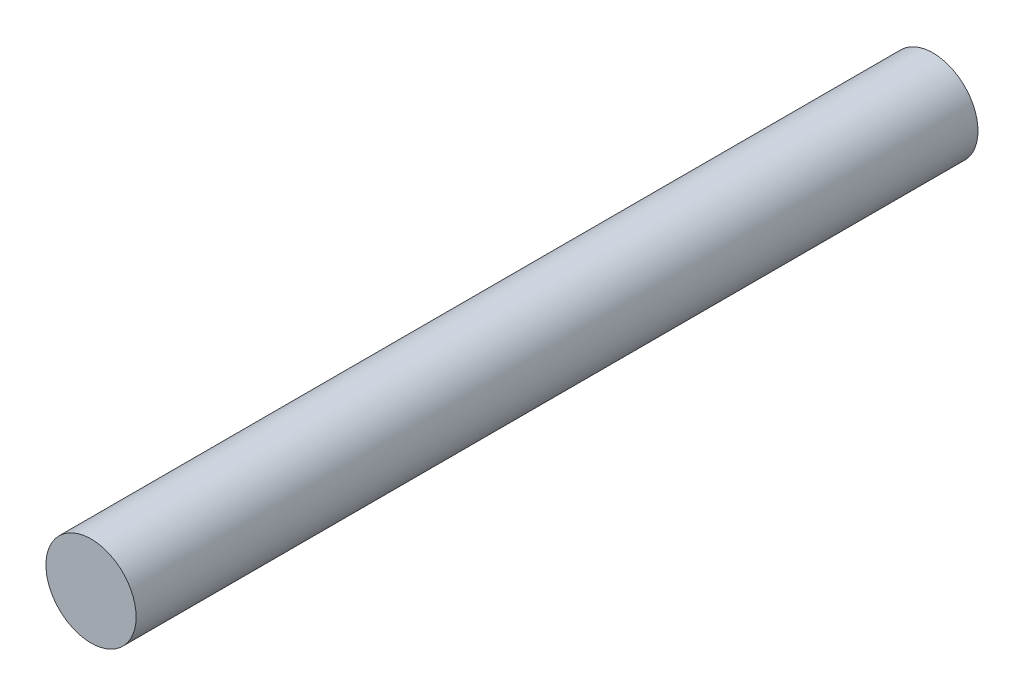
ISO-10303-21;
HEADER;
FILE_DESCRIPTION(('STEP AP214'),'2;1');
FILE_NAME('part.step','',(''),(''),'','','');
FILE_SCHEMA(('AUTOMOTIVE_DESIGN { 1 0 10303 214 1 1 1 1 }'));
ENDSEC;
DATA;
#1=APPLICATION_CONTEXT('core data for automotive mechanical design processes');
#2=APPLICATION_PROTOCOL_DEFINITION('international standard','automotive_design',2000,#1);
#3=PRODUCT_CONTEXT('',#1,'mechanical');
#4=PRODUCT('Part','Part','',(#3));
#5=PRODUCT_RELATED_PRODUCT_CATEGORY('part','',(#4));
#6=PRODUCT_DEFINITION_FORMATION('','',#4);
#7=PRODUCT_DEFINITION_CONTEXT('part definition',#1,'design');
#8=PRODUCT_DEFINITION('design','',#6,#7);
#9=PRODUCT_DEFINITION_SHAPE('','',#8);
#10=(LENGTH_UNIT() NAMED_UNIT(*) SI_UNIT(.MILLI.,.METRE.));
#11=(NAMED_UNIT(*) PLANE_ANGLE_UNIT() SI_UNIT($,.RADIAN.));
#12=(NAMED_UNIT(*) SI_UNIT($,.STERADIAN.) SOLID_ANGLE_UNIT());
#13=UNCERTAINTY_MEASURE_WITH_UNIT(LENGTH_MEASURE(1.E-05),#10,'distance_accuracy_value','');
#14=(GEOMETRIC_REPRESENTATION_CONTEXT(3) GLOBAL_UNCERTAINTY_ASSIGNED_CONTEXT((#13)) GLOBAL_UNIT_ASSIGNED_CONTEXT((#10,
#11,#12)) REPRESENTATION_CONTEXT('',''));
#15=CARTESIAN_POINT('',(0.,0.,0.));
#16=DIRECTION('',(0.,0.,1.));
#17=DIRECTION('',(1.,0.,0.));
#18=AXIS2_PLACEMENT_3D('',#15,#16,#17);
#19=CARTESIAN_POINT('',(0.,0.,56.));
#20=DIRECTION('',(0.,0.,-1.));
#21=DIRECTION('',(-1.,0.,0.));
#22=AXIS2_PLACEMENT_3D('',#19,#20,#21);
#23=CYLINDRICAL_SURFACE('',#22,3.);
#24=CARTESIAN_POINT('',(0.,0.,56.));
#25=DIRECTION('',(0.,0.,1.));
#26=DIRECTION('',(1.,0.,0.));
#27=AXIS2_PLACEMENT_3D('',#24,#25,#26);
#28=CIRCLE('',#27,3.);
#29=CARTESIAN_POINT('',(3.,0.,56.));
#30=VERTEX_POINT('',#29);
#31=EDGE_CURVE('E10',#30,#30,#28,.T.);
#32=ORIENTED_EDGE('',*,*,#31,.F.);
#33=EDGE_LOOP('',(#32));
#34=FACE_BOUND('',#33,.T.);
#35=CARTESIAN_POINT('',(0.,0.,0.));
#36=DIRECTION('',(0.,0.,1.));
#37=DIRECTION('',(1.,0.,0.));
#38=AXIS2_PLACEMENT_3D('',#35,#36,#37);
#39=CIRCLE('',#38,3.);
#40=CARTESIAN_POINT('',(3.,0.,0.));
#41=VERTEX_POINT('',#40);
#42=EDGE_CURVE('E34',#41,#41,#39,.T.);
#43=ORIENTED_EDGE('',*,*,#42,.T.);
#44=EDGE_LOOP('',(#43));
#45=FACE_BOUND('',#44,.T.);
#46=ADVANCED_FACE('F31',(#34,#45),#23,.T.);
#47=CARTESIAN_POINT('',(0.,0.,56.));
#48=DIRECTION('',(0.,0.,1.));
#49=DIRECTION('',(1.,0.,0.));
#50=AXIS2_PLACEMENT_3D('',#47,#48,#49);
#51=PLANE('',#50);
#52=ORIENTED_EDGE('',*,*,#31,.T.);
#53=EDGE_LOOP('',(#52));
#54=FACE_BOUND('',#53,.T.);
#55=ADVANCED_FACE('F46',(#54),#51,.T.);
#56=CARTESIAN_POINT('',(0.,0.,0.));
#57=DIRECTION('',(0.,0.,1.));
#58=DIRECTION('',(1.,0.,0.));
#59=AXIS2_PLACEMENT_3D('',#56,#57,#58);
#60=PLANE('',#59);
#61=ORIENTED_EDGE('',*,*,#42,.F.);
#62=EDGE_LOOP('',(#61));
#63=FACE_BOUND('',#62,.T.);
#64=ADVANCED_FACE('F44',(#63),#60,.F.);
#65=CLOSED_SHELL('',(#46,#55,#64));
#66=MANIFOLD_SOLID_BREP('B2',#65);
#67=ADVANCED_BREP_SHAPE_REPRESENTATION('',(#18,#66),#14);
#68=SHAPE_DEFINITION_REPRESENTATION(#9,#67);
ENDSEC;
END-ISO-10303-21;
